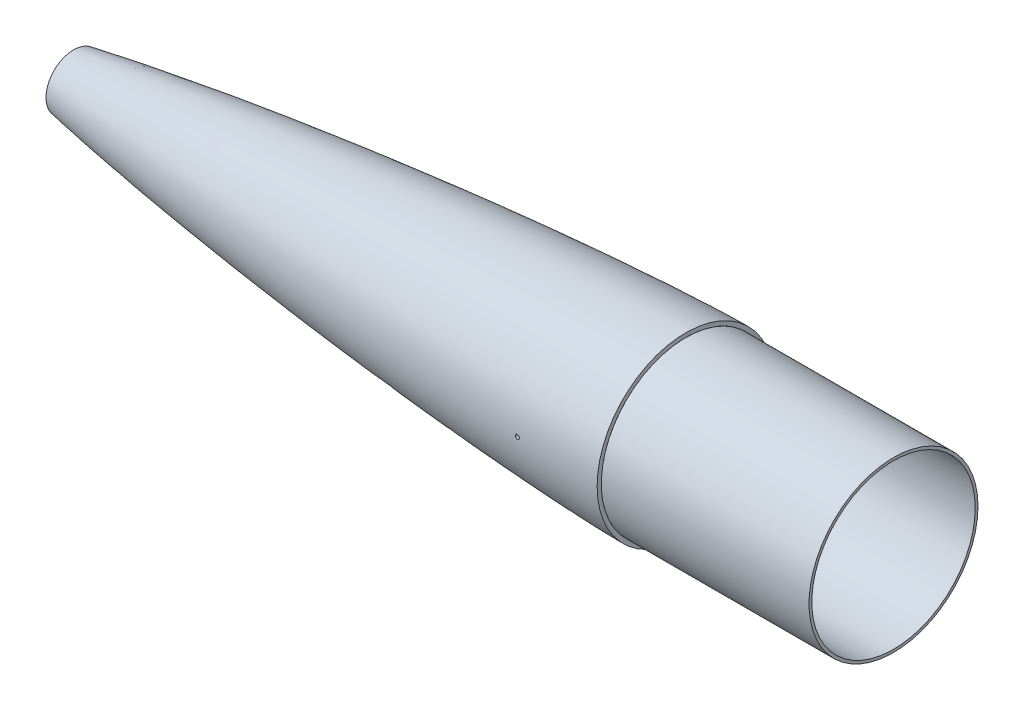
ISO-10303-21;
HEADER;
FILE_DESCRIPTION(('STEP AP214'),'2;1');
FILE_NAME('part.step','',(''),(''),'','','');
FILE_SCHEMA(('AUTOMOTIVE_DESIGN { 1 0 10303 214 1 1 1 1 }'));
ENDSEC;
DATA;
#1=APPLICATION_CONTEXT('core data for automotive mechanical design processes');
#2=APPLICATION_PROTOCOL_DEFINITION('international standard','automotive_design',2000,#1);
#3=PRODUCT_CONTEXT('',#1,'mechanical');
#4=PRODUCT('Part','Part','',(#3));
#5=PRODUCT_RELATED_PRODUCT_CATEGORY('part','',(#4));
#6=PRODUCT_DEFINITION_FORMATION('','',#4);
#7=PRODUCT_DEFINITION_CONTEXT('part definition',#1,'design');
#8=PRODUCT_DEFINITION('design','',#6,#7);
#9=PRODUCT_DEFINITION_SHAPE('','',#8);
#10=(LENGTH_UNIT() NAMED_UNIT(*) SI_UNIT(.MILLI.,.METRE.));
#11=(NAMED_UNIT(*) PLANE_ANGLE_UNIT() SI_UNIT($,.RADIAN.));
#12=(NAMED_UNIT(*) SI_UNIT($,.STERADIAN.) SOLID_ANGLE_UNIT());
#13=UNCERTAINTY_MEASURE_WITH_UNIT(LENGTH_MEASURE(1.E-05),#10,'distance_accuracy_value','');
#14=(GEOMETRIC_REPRESENTATION_CONTEXT(3) GLOBAL_UNCERTAINTY_ASSIGNED_CONTEXT((#13)) GLOBAL_UNIT_ASSIGNED_CONTEXT((#10,
#11,#12)) REPRESENTATION_CONTEXT('',''));
#15=CARTESIAN_POINT('',(0.,0.,0.));
#16=DIRECTION('',(0.,0.,1.));
#17=DIRECTION('',(1.,0.,0.));
#18=AXIS2_PLACEMENT_3D('',#15,#16,#17);
#19=CARTESIAN_POINT('',(672.,0.,0.));
#20=DIRECTION('',(1.,0.,0.));
#21=DIRECTION('',(0.,0.,-1.));
#22=AXIS2_PLACEMENT_3D('',#19,#20,#21);
#23=PLANE('',#22);
#24=CARTESIAN_POINT('',(672.,0.,0.));
#25=DIRECTION('',(1.,0.,0.));
#26=DIRECTION('',(0.,0.,-1.));
#27=AXIS2_PLACEMENT_3D('',#24,#25,#26);
#28=CIRCLE('',#27,61.);
#29=CARTESIAN_POINT('',(672.,0.,-61.));
#30=VERTEX_POINT('',#29);
#31=EDGE_CURVE('E12',#30,#30,#28,.T.);
#32=ORIENTED_EDGE('',*,*,#31,.T.);
#33=EDGE_LOOP('',(#32));
#34=FACE_BOUND('',#33,.T.);
#35=CARTESIAN_POINT('',(672.,0.,0.));
#36=DIRECTION('',(1.,0.,0.));
#37=DIRECTION('',(0.,0.,-1.));
#38=AXIS2_PLACEMENT_3D('',#35,#36,#37);
#39=CIRCLE('',#38,59.);
#40=CARTESIAN_POINT('',(672.,0.,-59.));
#41=VERTEX_POINT('',#40);
#42=EDGE_CURVE('E63',#41,#41,#39,.T.);
#43=ORIENTED_EDGE('',*,*,#42,.F.);
#44=EDGE_LOOP('',(#43));
#45=FACE_BOUND('',#44,.T.);
#46=ADVANCED_FACE('F52',(#34,#45),#23,.T.);
#47=CARTESIAN_POINT('',(522.,0.,0.));
#48=DIRECTION('',(1.,0.,0.));
#49=DIRECTION('',(0.,0.,-1.));
#50=AXIS2_PLACEMENT_3D('',#47,#48,#49);
#51=PLANE('',#50);
#52=CARTESIAN_POINT('',(522.,0.,0.));
#53=DIRECTION('',(1.,0.,0.));
#54=DIRECTION('',(0.,0.,-1.));
#55=AXIS2_PLACEMENT_3D('',#52,#53,#54);
#56=CIRCLE('',#55,61.);
#57=CARTESIAN_POINT('',(522.,0.,-61.));
#58=VERTEX_POINT('',#57);
#59=EDGE_CURVE('E56',#58,#58,#56,.T.);
#60=ORIENTED_EDGE('',*,*,#59,.F.);
#61=EDGE_LOOP('',(#60));
#62=FACE_BOUND('',#61,.T.);
#63=CARTESIAN_POINT('',(522.,0.,0.));
#64=DIRECTION('',(1.,0.,0.));
#65=DIRECTION('',(0.,0.,-1.));
#66=AXIS2_PLACEMENT_3D('',#63,#64,#65);
#67=CIRCLE('',#66,59.);
#68=CARTESIAN_POINT('',(522.,0.,-59.));
#69=VERTEX_POINT('',#68);
#70=EDGE_CURVE('E65',#69,#69,#67,.T.);
#71=ORIENTED_EDGE('',*,*,#70,.T.);
#72=EDGE_LOOP('',(#71));
#73=FACE_BOUND('',#72,.T.);
#74=ADVANCED_FACE('F75',(#62,#73),#51,.F.);
#75=CARTESIAN_POINT('',(672.,0.,0.));
#76=DIRECTION('',(-1.,0.,0.));
#77=DIRECTION('',(0.,0.,1.));
#78=AXIS2_PLACEMENT_3D('',#75,#76,#77);
#79=CYLINDRICAL_SURFACE('',#78,61.);
#80=ORIENTED_EDGE('',*,*,#31,.F.);
#81=EDGE_LOOP('',(#80));
#82=FACE_BOUND('',#81,.T.);
#83=ORIENTED_EDGE('',*,*,#59,.T.);
#84=EDGE_LOOP('',(#83));
#85=FACE_BOUND('',#84,.T.);
#86=ADVANCED_FACE('F54',(#82,#85),#79,.T.);
#87=CARTESIAN_POINT('',(672.,0.,0.));
#88=DIRECTION('',(-1.,0.,0.));
#89=DIRECTION('',(0.,0.,1.));
#90=AXIS2_PLACEMENT_3D('',#87,#88,#89);
#91=CYLINDRICAL_SURFACE('',#90,59.);
#92=ORIENTED_EDGE('',*,*,#42,.T.);
#93=EDGE_LOOP('',(#92));
#94=FACE_BOUND('',#93,.T.);
#95=ORIENTED_EDGE('',*,*,#70,.F.);
#96=EDGE_LOOP('',(#95));
#97=FACE_BOUND('',#96,.T.);
#98=ADVANCED_FACE('F71',(#94,#97),#91,.F.);
#99=CLOSED_SHELL('',(#46,#74,#86,#98));
#100=MANIFOLD_SOLID_BREP('B2',#99);
#101=CARTESIAN_POINT('',(522.,64.,0.));
#102=CARTESIAN_POINT('',(521.590516942007,64.,0.));
#103=CARTESIAN_POINT('',(520.771561040287,63.9942688934299,0.));
#104=CARTESIAN_POINT('',(519.133691426009,63.9802670014868,0.));
#105=CARTESIAN_POINT('',(516.677010913587,63.9463939524722,0.));
#106=CARTESIAN_POINT('',(513.81106355721,63.8963781150164,0.));
#107=CARTESIAN_POINT('',(508.079596574187,63.7736937527318,0.));
#108=CARTESIAN_POINT('',(502.151121166139,63.6094457906622,0.));
#109=CARTESIAN_POINT('',(496.025715941466,63.409883926183,0.));
#110=CARTESIAN_POINT('',(489.703465178406,63.1762923349364,0.));
#111=CARTESIAN_POINT('',(485.63900431218,63.0166861878967,0.));
#112=CARTESIAN_POINT('',(480.558876848224,62.8060522017456,0.));
#113=CARTESIAN_POINT('',(474.463438705073,62.5365027866264,0.));
#114=CARTESIAN_POINT('',(467.353134193147,62.1993055640769,0.));
#115=CARTESIAN_POINT('',(459.228488268017,61.7852756732708,0.));
#116=CARTESIAN_POINT('',(449.074445036233,61.234348915932,0.));
#117=CARTESIAN_POINT('',(436.892399390841,60.5230064918632,0.));
#118=CARTESIAN_POINT('',(422.684094329235,59.6255360051907,0.));
#119=CARTESIAN_POINT('',(406.451649281317,58.5145436942091,0.));
#120=CARTESIAN_POINT('',(390.224875337688,57.3236348081094,0.));
#121=CARTESIAN_POINT('',(374.003843123209,56.0568670763544,0.));
#122=CARTESIAN_POINT('',(357.788673830139,54.717201132632,0.));
#123=CARTESIAN_POINT('',(337.527208668775,52.9542978334076,0.));
#124=CARTESIAN_POINT('',(313.225812894759,50.7004206895206,0.));
#125=CARTESIAN_POINT('',(284.893049860698,47.8733531730444,0.));
#126=CARTESIAN_POINT('',(252.541063500701,44.3705230861258,0.));
#127=CARTESIAN_POINT('',(220.220524829406,40.5877041843803,0.));
#128=CARTESIAN_POINT('',(187.93626848825,36.5067060471793,0.));
#129=CARTESIAN_POINT('',(155.694792913666,32.0989089346133,0.));
#130=CARTESIAN_POINT('',(123.506939436542,27.3147890527032,0.));
#131=CARTESIAN_POINT('',(91.3889285154668,22.077714796997,0.));
#132=CARTESIAN_POINT('',(62.8439543785186,16.872422149387,0.));
#133=CARTESIAN_POINT('',(39.4821084234338,12.0345623327772,0.));
#134=CARTESIAN_POINT('',(22.6082275835392,7.96176973354541,0.));
#135=CARTESIAN_POINT('',(12.8800296426853,5.24028530882847,0.));
#136=CARTESIAN_POINT('',(7.19313976770063,3.38812297662853,0.));
#137=CARTESIAN_POINT('',(4.12322816040121,2.23009214067667,0.));
#138=CARTESIAN_POINT('',(2.46511193855896,1.51464459715414,0.));
#139=CARTESIAN_POINT('',(1.534590026526,1.06017013162303,0.));
#140=CARTESIAN_POINT('',(0.982994633851909,0.758855245518446,0.));
#141=CARTESIAN_POINT('',(0.660423816631462,0.562634850320563,0.));
#142=CARTESIAN_POINT('',(0.460446691137349,0.428551795033052,0.));
#143=CARTESIAN_POINT('',(0.333600700303157,0.33590032232443,0.));
#144=CARTESIAN_POINT('',(0.253680330401727,0.273933255901504,0.));
#145=CARTESIAN_POINT('',(0.184725886275937,0.216219225073717,0.));
#146=CARTESIAN_POINT('',(0.126589164605975,0.163112600127914,0.));
#147=CARTESIAN_POINT('',(0.0792582841063476,0.115021795232016,0.));
#148=CARTESIAN_POINT('',(0.0466617169851801,0.0779953229370678,0.));
#149=CARTESIAN_POINT('',(0.0215064173775888,0.0441662632204878,0.));
#150=CARTESIAN_POINT('',(0.00677148560998358,0.0199364911642674,0.));
#151=CARTESIAN_POINT('',(0.00182695339847098,0.00681618098661998,0.));
#152=CARTESIAN_POINT('',(0.,0.,0.));
#153=B_SPLINE_CURVE_WITH_KNOTS('',4,(#101,#102,#103,#104,#105,#106,#107,#108,#109,#110,#111,
#112,#113,#114,#115,#116,#117,#118,#119,#120,#121,#122,#123,#124,#125,#126,#127,#128,#129,#130,
#131,#132,#133,#134,#135,#136,#137,#138,#139,#140,#141,#142,#143,#144,#145,#146,#147,#148,#149,
#150,#151,#152),.UNSPECIFIED.,.F.,.F.,(5,1,1,1,1,1,1,1,1,1,1,1,1,1,1,1,1,1,1,1,1,1,1,1,1,1,1,1,
1,1,1,1,1,1,1,1,1,1,1,1,1,1,1,1,1,1,1,1,5),(0.,0.00310644739088894,0.00621289478177789,
0.0124257895635557,0.0186386843453334,0.0248515791271113,0.0497031582542228,0.0574176140747542,
0.0651320698952855,0.0728465257158168,0.0805609815363483,0.095989893177411,0.111418804818474,
0.12684768666646,0.142276568514445,0.173134332210417,0.20399214040648,0.234849948602543,
0.265707766276664,0.296565583950786,0.327423428677223,0.358281273403661,0.419996827228449,
0.481712432966205,0.543428043582617,0.605143624865866,0.666859247489944,0.72857493688404,
0.790290361928457,0.852005914200549,0.913721421920756,0.948680452149767,0.971252136817206,
0.983668328658008,0.990336505939893,0.99403931307382,0.996134647532728,0.997363630870977,
0.998189895614069,0.998806063777457,0.998997830505255,0.999189597233053,0.999381363960851,
0.999573130688649,0.999679848016487,0.999786565344324,0.999893282672162,0.999946641336081,1.),.UNSPECIFIED.);
#154=CARTESIAN_POINT('',(-5.18625797548872,0.,0.));
#155=DIRECTION('',(-1.,0.,0.));
#156=AXIS1_PLACEMENT('',#154,#155);
#157=SURFACE_OF_REVOLUTION('',#153,#156);
#158=CARTESIAN_POINT('',(80.,0.,0.));
#159=DIRECTION('',(-1.,0.,0.));
#160=DIRECTION('',(0.,0.,1.));
#161=AXIS2_PLACEMENT_3D('',#158,#159,#160);
#162=CIRCLE('',#161,19.9360865732292);
#163=CARTESIAN_POINT('',(80.,0.,19.9360865732292));
#164=VERTEX_POINT('',#163);
#165=EDGE_CURVE('E129',#164,#164,#162,.F.);
#166=ORIENTED_EDGE('',*,*,#165,.T.);
#167=EDGE_LOOP('',(#166));
#168=FACE_BOUND('',#167,.T.);
#169=CARTESIAN_POINT('',(522.,0.,0.));
#170=DIRECTION('',(-1.,0.,0.));
#171=DIRECTION('',(0.,0.,1.));
#172=AXIS2_PLACEMENT_3D('',#169,#170,#171);
#173=CIRCLE('',#172,64.);
#174=CARTESIAN_POINT('',(522.,0.,64.));
#175=VERTEX_POINT('',#174);
#176=EDGE_CURVE('E51',#175,#175,#173,.T.);
#177=ORIENTED_EDGE('',*,*,#176,.T.);
#178=EDGE_LOOP('',(#177));
#179=FACE_BOUND('',#178,.T.);
#180=CARTESIAN_POINT('',(460.837660246588,0.,61.8638069051147));
#181=CARTESIAN_POINT('',(460.837666027799,-0.0842370751397705,61.8638068896487));
#182=CARTESIAN_POINT('',(460.844789632762,-0.168561694612749,61.864002988358));
#183=CARTESIAN_POINT('',(460.865981434843,-0.293170848475532,61.8645972576345));
#184=CARTESIAN_POINT('',(460.874808022259,-0.334427408478112,61.8648456955621));
#185=CARTESIAN_POINT('',(460.895908942444,-0.416091306418316,61.8654459255403));
#186=CARTESIAN_POINT('',(460.908186312636,-0.456497862340091,61.8657978086573));
#187=CARTESIAN_POINT('',(460.950037272364,-0.575841458920336,61.8670124920384));
#188=CARTESIAN_POINT('',(460.984657704452,-0.653065965546182,61.8680350696924));
#189=CARTESIAN_POINT('',(461.06637895112,-0.800596422932289,61.8705407559452));
#190=CARTESIAN_POINT('',(461.113480019562,-0.870902232923232,61.8720238739116));
#191=CARTESIAN_POINT('',(461.192426062857,-0.969650775783818,61.8746193704708));
#192=CARTESIAN_POINT('',(461.220146083368,-1.00146846801379,61.8755471171123));
#193=CARTESIAN_POINT('',(461.278133334341,-1.06262749790153,61.8775294689821));
#194=CARTESIAN_POINT('',(461.308398090934,-1.0919711863222,61.8785839514228));
#195=CARTESIAN_POINT('',(461.402763306244,-1.1760322142952,61.8819451280918));
#196=CARTESIAN_POINT('',(461.470454375489,-1.22680406294593,61.8844501827811));
#197=CARTESIAN_POINT('',(461.613366058309,-1.31625070791574,61.8899955507075));
#198=CARTESIAN_POINT('',(461.688588968133,-1.35492180013615,61.8930360273957));
#199=CARTESIAN_POINT('',(461.844445779859,-1.41909753583378,61.8996354738888));
#200=CARTESIAN_POINT('',(461.925079690797,-1.44460215732054,61.9031944445597));
#201=CARTESIAN_POINT('',(462.089527080562,-1.48173640564699,61.9107811169701));
#202=CARTESIAN_POINT('',(462.173343115707,-1.49335462280733,61.9148092011762));
#203=CARTESIAN_POINT('',(462.341718029691,-1.5023618092746,61.9232403050907));
#204=CARTESIAN_POINT('',(462.426276912906,-1.49975069468264,61.9276433270097));
#205=CARTESIAN_POINT('',(462.593849327793,-1.48036826398961,61.9366997060638));
#206=CARTESIAN_POINT('',(462.6768608011,-1.46357929561787,61.9413533684959));
#207=CARTESIAN_POINT('',(462.838880539791,-1.41629792376656,61.9507408285188));
#208=CARTESIAN_POINT('',(462.917888770745,-1.38580540245713,61.9554746267982));
#209=CARTESIAN_POINT('',(463.069735953586,-1.31194506983985,61.9648352891637));
#210=CARTESIAN_POINT('',(463.1425691877,-1.26856548950026,61.9694620513184));
#211=CARTESIAN_POINT('',(463.2799174339,-1.17016584455206,61.9783976722214));
#212=CARTESIAN_POINT('',(463.344432451017,-1.11514578698358,61.9827065311621));
#213=CARTESIAN_POINT('',(463.463277979969,-0.995046894917016,61.9907974211621));
#214=CARTESIAN_POINT('',(463.51761325994,-0.929972795871852,61.994579698655));
#215=CARTESIAN_POINT('',(463.61458077874,-0.791588234535177,62.0014276995377));
#216=CARTESIAN_POINT('',(463.657213147157,-0.71827786345759,62.0044934308618));
#217=CARTESIAN_POINT('',(463.7294722341,-0.565661571969206,62.0097405545803));
#218=CARTESIAN_POINT('',(463.759125574802,-0.486368319112038,62.0119237564812));
#219=CARTESIAN_POINT('',(463.804698197319,-0.323908675214442,62.0152962030668));
#220=CARTESIAN_POINT('',(463.82061768719,-0.240742342868033,62.0164854628088));
#221=CARTESIAN_POINT('',(463.838240701521,-0.0731074059386987,62.0178027088474));
#222=CARTESIAN_POINT('',(463.839977643394,0.0113576673031792,62.0179331898708));
#223=CARTESIAN_POINT('',(463.829273297658,0.179378992215525,62.0171322171401));
#224=CARTESIAN_POINT('',(463.816832107269,0.262935250113878,62.0162007706677));
#225=CARTESIAN_POINT('',(463.778146556754,0.426699558819114,62.0133285489861));
#226=CARTESIAN_POINT('',(463.751913188778,0.506910221145377,62.0113885775692));
#227=CARTESIAN_POINT('',(463.68640360686,0.661786246117321,62.0066051261582));
#228=CARTESIAN_POINT('',(463.647127309143,0.736451573141194,62.0037616403608));
#229=CARTESIAN_POINT('',(463.556588827422,0.878235853236073,61.9973168946406));
#230=CARTESIAN_POINT('',(463.505309624153,0.945343888604484,61.9937145594558));
#231=CARTESIAN_POINT('',(463.392254887833,1.07000509379862,61.9859382996372));
#232=CARTESIAN_POINT('',(463.33047920444,1.12755812674474,61.9817643668167));
#233=CARTESIAN_POINT('',(463.198015377869,1.23162517215504,61.9730362109347));
#234=CARTESIAN_POINT('',(463.127305620839,1.27811159741821,61.9684810749837));
#235=CARTESIAN_POINT('',(462.979095528094,1.35855450899805,61.9592063659535));
#236=CARTESIAN_POINT('',(462.901595129248,1.39251087880853,61.9544867913457));
#237=CARTESIAN_POINT('',(462.741860463757,1.44698105582794,61.9450713246482));
#238=CARTESIAN_POINT('',(462.65961858821,1.46747256306952,61.9403754845627));
#239=CARTESIAN_POINT('',(462.492849616463,1.49433939271326,61.9311888918623));
#240=CARTESIAN_POINT('',(462.408322513951,1.5007146761106,61.926698139814));
#241=CARTESIAN_POINT('',(462.239381400354,1.49915820863997,61.918062436484));
#242=CARTESIAN_POINT('',(462.15496738636,1.49122683326171,61.9139174761296));
#243=CARTESIAN_POINT('',(461.988664887554,1.46128186909068,61.9060761546721));
#244=CARTESIAN_POINT('',(461.906776393448,1.4392683321314,61.9023797919179));
#245=CARTESIAN_POINT('',(461.747903003957,1.38177611702029,61.895500687542));
#246=CARTESIAN_POINT('',(461.670912773228,1.34631239296333,61.8923173810783));
#247=CARTESIAN_POINT('',(461.560794136447,1.28384852660663,61.887947705642));
#248=CARTESIAN_POINT('',(461.524976334323,1.26147759969063,61.8865584782034));
#249=CARTESIAN_POINT('',(461.455313350294,1.21377401556355,61.8839122313013));
#250=CARTESIAN_POINT('',(461.421470103329,1.18843852396538,61.8826553405805));
#251=CARTESIAN_POINT('',(461.323452462063,1.10836849135714,61.8790887637944));
#252=CARTESIAN_POINT('',(461.262603899514,1.04946447477291,61.8769758864022));
#253=CARTESIAN_POINT('',(461.151673035429,0.922256100704995,61.8732567880433));
#254=CARTESIAN_POINT('',(461.101590471935,0.853951972008965,61.8716505547485));
#255=CARTESIAN_POINT('',(461.035615526068,0.745966600294932,61.8695944743011));
#256=CARTESIAN_POINT('',(461.015138473256,0.709024403138267,61.8689677031725));
#257=CARTESIAN_POINT('',(460.977383966304,0.633582986440566,61.8678276666694));
#258=CARTESIAN_POINT('',(460.960103704035,0.595085169963751,61.8673143015988));
#259=CARTESIAN_POINT('',(460.913259177594,0.477661048458617,61.8659378001716));
#260=CARTESIAN_POINT('',(460.888617964512,0.396684007553707,61.8652360327229));
#261=CARTESIAN_POINT('',(460.859891728194,0.262675747774912,61.8644255924516));
#262=CARTESIAN_POINT('',(460.851566725075,0.210499428749106,61.8641933050101));
#263=CARTESIAN_POINT('',(460.84044917271,0.105560203457798,61.8638839661937));
#264=CARTESIAN_POINT('',(460.837656623097,0.0527972972312344,61.8638069148084));
#265=CARTESIAN_POINT('',(460.837660246588,0.,61.8638069051147));
#266=B_SPLINE_CURVE_WITH_KNOTS('',3,(#180,#181,#182,#183,#184,#185,#186,#187,#188,#189,#190,
#191,#192,#193,#194,#195,#196,#197,#198,#199,#200,#201,#202,#203,#204,#205,#206,#207,#208,#209,
#210,#211,#212,#213,#214,#215,#216,#217,#218,#219,#220,#221,#222,#223,#224,#225,#226,#227,#228,
#229,#230,#231,#232,#233,#234,#235,#236,#237,#238,#239,#240,#241,#242,#243,#244,#245,#246,#247,
#248,#249,#250,#251,#252,#253,#254,#255,#256,#257,#258,#259,#260,#261,#262,#263,#264,#265),
.UNSPECIFIED.,.T.,.F.,(4,2,2,2,2,2,2,2,2,2,2,2,2,2,2,2,2,2,2,2,2,2,2,2,2,2,2,2,2,2,2,2,2,2,2,2,
2,2,2,2,2,2,4),(0.,0.252485331728898,0.378936050144934,0.5054984225542,0.758131837412947,
1.01077039134415,1.13726649599376,1.2636410184841,1.51629688703939,1.76903001926361,
2.02176357359775,2.27470464247533,2.52764720274374,2.78090515664487,3.03416528822354,
3.28765742289587,3.54114940425706,3.79452235285327,4.0478924957064,4.3007404698738,
4.55358461353944,4.80583282458993,5.05807930595574,5.31012505489417,5.56217242276965,
5.81457936426467,6.06698992128796,6.32002325684595,6.57305894508372,6.82651265170361,
7.07996705864558,7.33341481357057,7.58686163561301,7.84002749429483,7.96665661146186,
8.09340780206124,8.34627527259365,8.59913658971787,8.72573020005776,8.85221207427852,
9.10475908921145,9.26300940795252,9.42125971618914),.UNSPECIFIED.);
#267=CARTESIAN_POINT('',(460.837660246588,0.,61.8638069051147));
#268=VERTEX_POINT('',#267);
#269=EDGE_CURVE('E153',#268,#268,#266,.T.);
#270=ORIENTED_EDGE('',*,*,#269,.F.);
#271=EDGE_LOOP('',(#270));
#272=FACE_BOUND('',#271,.T.);
#273=ADVANCED_FACE('F114',(#168,#179,#272),#157,.T.);
#274=CARTESIAN_POINT('',(522.,64.,0.));
#275=CARTESIAN_POINT('',(521.590516942007,64.,0.));
#276=CARTESIAN_POINT('',(520.771561040287,63.9942688934299,0.));
#277=CARTESIAN_POINT('',(519.133691426009,63.9802670014868,0.));
#278=CARTESIAN_POINT('',(516.677010913587,63.9463939524722,0.));
#279=CARTESIAN_POINT('',(513.81106355721,63.8963781150164,0.));
#280=CARTESIAN_POINT('',(508.079596574187,63.7736937527318,0.));
#281=CARTESIAN_POINT('',(502.151121166139,63.6094457906622,0.));
#282=CARTESIAN_POINT('',(496.025715941466,63.409883926183,0.));
#283=CARTESIAN_POINT('',(489.703465178406,63.1762923349364,0.));
#284=CARTESIAN_POINT('',(485.63900431218,63.0166861878967,0.));
#285=CARTESIAN_POINT('',(480.558876848224,62.8060522017456,0.));
#286=CARTESIAN_POINT('',(474.463438705073,62.5365027866264,0.));
#287=CARTESIAN_POINT('',(467.353134193147,62.1993055640769,0.));
#288=CARTESIAN_POINT('',(459.228488268017,61.7852756732708,0.));
#289=CARTESIAN_POINT('',(449.074445036233,61.234348915932,0.));
#290=CARTESIAN_POINT('',(436.892399390841,60.5230064918632,0.));
#291=CARTESIAN_POINT('',(422.684094329235,59.6255360051907,0.));
#292=CARTESIAN_POINT('',(406.451649281317,58.5145436942091,0.));
#293=CARTESIAN_POINT('',(390.224875337688,57.3236348081094,0.));
#294=CARTESIAN_POINT('',(374.003843123209,56.0568670763544,0.));
#295=CARTESIAN_POINT('',(357.788673830139,54.717201132632,0.));
#296=CARTESIAN_POINT('',(337.527208668775,52.9542978334076,0.));
#297=CARTESIAN_POINT('',(313.225812894759,50.7004206895206,0.));
#298=CARTESIAN_POINT('',(284.893049860698,47.8733531730444,0.));
#299=CARTESIAN_POINT('',(252.541063500701,44.3705230861258,0.));
#300=CARTESIAN_POINT('',(220.220524829406,40.5877041843803,0.));
#301=CARTESIAN_POINT('',(187.93626848825,36.5067060471793,0.));
#302=CARTESIAN_POINT('',(155.694792913666,32.0989089346133,0.));
#303=CARTESIAN_POINT('',(124.665008945171,27.4869143348317,0.));
#304=CARTESIAN_POINT('',(101.729661531689,23.7630447706086,0.));
#305=CARTESIAN_POINT('',(86.8535653702416,21.1735362402076,0.));
#306=CARTESIAN_POINT('',(80.,19.9360865732292,0.));
#307=B_SPLINE_CURVE_WITH_KNOTS('',4,(#274,#275,#276,#277,#278,#279,#280,#281,#282,#283,#284,
#285,#286,#287,#288,#289,#290,#291,#292,#293,#294,#295,#296,#297,#298,#299,#300,#301,#302,#303,
#304,#305,#306),.UNSPECIFIED.,.F.,.F.,(5,1,1,1,1,1,1,1,1,1,1,1,1,1,1,1,1,1,1,1,1,1,1,1,1,1,1,1,
1,5),(0.,0.00310644739088894,0.00621289478177789,0.0124257895635557,0.0186386843453334,
0.0248515791271113,0.0497031582542228,0.0574176140747542,0.0651320698952855,0.0728465257158168,
0.0805609815363483,0.095989893177411,0.111418804818474,0.12684768666646,0.142276568514445,
0.173134332210417,0.20399214040648,0.234849948602543,0.265707766276664,0.296565583950786,
0.327423428677223,0.358281273403661,0.419996827228449,0.481712432966205,0.543428043582617,
0.605143624865866,0.666859247489944,0.72857493688404,0.790290361928457,0.84312418835599),.UNSPECIFIED.);
#308=CARTESIAN_POINT('',(-5.18625797548872,0.,0.));
#309=DIRECTION('',(-1.,0.,0.));
#310=AXIS1_PLACEMENT('',#308,#309);
#311=SURFACE_OF_REVOLUTION('',#307,#310);
#312=OFFSET_SURFACE('',#311,-3.,.F.);
#313=CARTESIAN_POINT('',(522.,0.,0.));
#314=DIRECTION('',(-1.,0.,0.));
#315=DIRECTION('',(0.,0.,1.));
#316=AXIS2_PLACEMENT_3D('',#313,#314,#315);
#317=CIRCLE('',#316,61.);
#318=CARTESIAN_POINT('',(522.,0.,61.));
#319=VERTEX_POINT('',#318);
#320=EDGE_CURVE('E135',#319,#319,#317,.T.);
#321=ORIENTED_EDGE('',*,*,#320,.F.);
#322=EDGE_LOOP('',(#321));
#323=FACE_BOUND('',#322,.T.);
#324=CARTESIAN_POINT('',(83.,0.,0.));
#325=DIRECTION('',(-1.,0.,0.));
#326=DIRECTION('',(0.,0.,1.));
#327=AXIS2_PLACEMENT_3D('',#324,#325,#326);
#328=CIRCLE('',#327,17.4271010671349);
#329=CARTESIAN_POINT('',(83.,0.,17.4271010671349));
#330=VERTEX_POINT('',#329);
#331=EDGE_CURVE('E144',#330,#330,#328,.F.);
#332=ORIENTED_EDGE('',*,*,#331,.F.);
#333=EDGE_LOOP('',(#332));
#334=FACE_BOUND('',#333,.T.);
#335=CARTESIAN_POINT('',(460.837660246588,0.,58.8597578813491));
#336=CARTESIAN_POINT('',(460.837666027168,-0.084239020388774,58.8597578498814));
#337=CARTESIAN_POINT('',(460.844789954198,-0.1685655478458,58.8599455364727));
#338=CARTESIAN_POINT('',(460.865982740885,-0.293177541221433,58.8605153543279));
#339=CARTESIAN_POINT('',(460.874809735646,-0.334435030508645,58.8607536562279));
#340=CARTESIAN_POINT('',(460.895911646636,-0.41610078077672,58.8613299870545));
#341=CARTESIAN_POINT('',(460.908189600919,-0.456508259607786,58.8616681038663));
#342=CARTESIAN_POINT('',(460.950042622875,-0.575854683214812,58.8628366608941));
#343=CARTESIAN_POINT('',(460.984664827753,-0.653081059766016,58.8638220161537));
#344=CARTESIAN_POINT('',(461.066390466674,-0.800614976764113,58.8662446754475));
#345=CARTESIAN_POINT('',(461.113494151465,-0.870922378173363,58.8676819885614));
#346=CARTESIAN_POINT('',(461.192444278369,-0.969672321370872,58.8702064653264));
#347=CARTESIAN_POINT('',(461.220165412834,-1.00149007070083,58.8711101262751));
#348=CARTESIAN_POINT('',(461.278154992322,-1.06264912459077,58.8730442788537));
#349=CARTESIAN_POINT('',(461.30842096345,-1.09199277993628,58.8740746477484));
#350=CARTESIAN_POINT('',(461.402789938684,-1.17605350719007,58.8773644881668));
#351=CARTESIAN_POINT('',(461.470483688964,-1.22682490994274,58.8798233066088));
#352=CARTESIAN_POINT('',(461.613397904255,-1.31626813463252,58.8852844138035));
#353=CARTESIAN_POINT('',(461.688620364987,-1.35493673707062,58.88828684683));
#354=CARTESIAN_POINT('',(461.844475483738,-1.41910775817379,58.8948231435843));
#355=CARTESIAN_POINT('',(461.925108149574,-1.44461015781844,58.8983570080799));
#356=CARTESIAN_POINT('',(462.089549879162,-1.48173997759187,58.9059095253695));
#357=CARTESIAN_POINT('',(462.173361417988,-1.49335634734584,58.9099285614623));
#358=CARTESIAN_POINT('',(462.341726229525,-1.50236150238016,58.9183591561768));
#359=CARTESIAN_POINT('',(462.426279506696,-1.49975020205811,58.92277071716));
#360=CARTESIAN_POINT('',(462.59384221828,-1.48036927917076,58.9318613558199));
#361=CARTESIAN_POINT('',(462.676849549373,-1.46358162934601,58.9365407670403));
#362=CARTESIAN_POINT('',(462.838860787505,-1.41630463761067,58.945994350314));
#363=CARTESIAN_POINT('',(462.917864658328,-1.38581517177222,58.950768523224));
#364=CARTESIAN_POINT('',(463.069708883212,-1.31196019764881,58.9602208161035));
#365=CARTESIAN_POINT('',(463.142543095462,-1.26858204802193,58.9648988369274));
#366=CARTESIAN_POINT('',(463.279893494554,-1.17018512909096,58.9739421388543));
#367=CARTESIAN_POINT('',(463.344409683822,-1.11516636318236,58.9783074200485));
#368=CARTESIAN_POINT('',(463.463260296268,-0.995067194278374,58.9865104587821));
#369=CARTESIAN_POINT('',(463.517599097271,-0.929991139534942,58.9903484429491));
#370=CARTESIAN_POINT('',(463.614573057923,-0.791601120800361,58.9973009980426));
#371=CARTESIAN_POINT('',(463.657208350012,-0.718287250043966,59.0004155771552));
#372=CARTESIAN_POINT('',(463.72947056163,-0.56566584805135,59.0057480193677));
#373=CARTESIAN_POINT('',(463.759124680785,-0.486371261233634,59.0079677566617));
#374=CARTESIAN_POINT('',(463.804698418344,-0.323908132195836,59.0113972431946));
#375=CARTESIAN_POINT('',(463.820618252719,-0.240739650913812,59.0126070083151));
#376=CARTESIAN_POINT('',(463.838240415773,-0.0731074428959635,59.0139468980386));
#377=CARTESIAN_POINT('',(463.839977399883,0.0113526211298722,59.0140796542798));
#378=CARTESIAN_POINT('',(463.829274821829,0.179363935238809,59.0132649776652));
#379=CARTESIAN_POINT('',(463.816835360533,0.262915191783957,59.0123175524949));
#380=CARTESIAN_POINT('',(463.778155771231,0.426666831489199,59.0093969371641));
#381=CARTESIAN_POINT('',(463.751927093214,0.506869935263089,59.0074245980648));
#382=CARTESIAN_POINT('',(463.686429800845,0.661731728008768,59.0025635164347));
#383=CARTESIAN_POINT('',(463.647161098476,0.736390379553019,58.9996747677184));
#384=CARTESIAN_POINT('',(463.55663795758,0.878167198444465,58.9931312127717));
#385=CARTESIAN_POINT('',(463.505365805106,0.945274002404795,58.989475275206));
#386=CARTESIAN_POINT('',(463.392326272031,1.06993431010694,58.9815894140417));
#387=CARTESIAN_POINT('',(463.330558735601,1.12748767197954,58.977359481921));
#388=CARTESIAN_POINT('',(463.198106076915,1.23156189921208,58.968522350614));
#389=CARTESIAN_POINT('',(463.127398606724,1.27805424464987,58.9639142164995));
#390=CARTESIAN_POINT('',(462.979191579304,1.35850925094974,58.9545425619156));
#391=CARTESIAN_POINT('',(462.901691957852,1.39247179332078,58.9497790399772));
#392=CARTESIAN_POINT('',(462.741955386317,1.44695475590795,58.9402890968258));
#393=CARTESIAN_POINT('',(462.659710734804,1.46745261420125,58.9355627509299));
#394=CARTESIAN_POINT('',(462.492934159911,1.49433087142016,58.92633177956));
#395=CARTESIAN_POINT('',(462.408402230935,1.50071123579739,58.9218271546287));
#396=CARTESIAN_POINT('',(462.239454506189,1.4991630519714,58.9131817177772));
#397=CARTESIAN_POINT('',(462.155038701519,1.4912356696936,58.9090408762414));
#398=CARTESIAN_POINT('',(461.988731378205,1.46129784542936,58.9012246324491));
#399=CARTESIAN_POINT('',(461.906839849324,1.43928746056957,58.8975492283047));
#400=CARTESIAN_POINT('',(461.747964581715,1.38180222243696,58.8907263026739));
#401=CARTESIAN_POINT('',(461.670975214892,1.34634314722361,58.8875781688073));
#402=CARTESIAN_POINT('',(461.560857047702,1.28388654911147,58.8832683829589));
#403=CARTESIAN_POINT('',(461.525039264036,1.26151809434917,58.8819003116631));
#404=CARTESIAN_POINT('',(461.455376059266,1.21381955250118,58.879298122927));
#405=CARTESIAN_POINT('',(461.421532572587,1.18848663149968,58.878064135875));
#406=CARTESIAN_POINT('',(461.323514408334,1.10842490690579,58.8745677635865));
#407=CARTESIAN_POINT('',(461.262665101577,1.04952686196531,58.8725037619345));
#408=CARTESIAN_POINT('',(461.151731433687,0.922330855144265,58.8688806922472));
#409=CARTESIAN_POINT('',(461.101646813981,0.854033119113165,58.8673216120829));
#410=CARTESIAN_POINT('',(461.035666903403,0.746056235782572,58.8653307265224));
#411=CARTESIAN_POINT('',(461.015187609186,0.709116007664556,58.864724768798));
#412=CARTESIAN_POINT('',(460.977428447576,0.633678431512554,58.8636239123887));
#413=CARTESIAN_POINT('',(460.960145772036,0.595182486715278,58.863128916145));
#414=CARTESIAN_POINT('',(460.913293701827,0.477763741679544,58.861802982555));
#415=CARTESIAN_POINT('',(460.888647092102,0.396790047216834,58.8611289520627));
#416=CARTESIAN_POINT('',(460.859907343462,0.262767326301062,58.8603510595445));
#417=CARTESIAN_POINT('',(460.851576494895,0.210573042231095,58.8601282918234));
#418=CARTESIAN_POINT('',(460.840451134434,0.105597305071772,58.8598317125936));
#419=CARTESIAN_POINT('',(460.837656622303,0.0528158520074045,58.8597579010785));
#420=CARTESIAN_POINT('',(460.837660246588,0.,58.8597578813491));
#421=B_SPLINE_CURVE_WITH_KNOTS('',3,(#335,#336,#337,#338,#339,#340,#341,#342,#343,#344,#345,
#346,#347,#348,#349,#350,#351,#352,#353,#354,#355,#356,#357,#358,#359,#360,#361,#362,#363,#364,
#365,#366,#367,#368,#369,#370,#371,#372,#373,#374,#375,#376,#377,#378,#379,#380,#381,#382,#383,
#384,#385,#386,#387,#388,#389,#390,#391,#392,#393,#394,#395,#396,#397,#398,#399,#400,#401,#402,
#403,#404,#405,#406,#407,#408,#409,#410,#411,#412,#413,#414,#415,#416,#417,#418,#419,#420),
.UNSPECIFIED.,.T.,.F.,(4,2,2,2,2,2,2,2,2,2,2,2,2,2,2,2,2,2,2,2,2,2,2,2,2,2,2,2,2,2,2,2,2,2,2,2,
2,2,2,2,2,2,4),(0.,0.252491101881712,0.378944620557007,0.505509813212116,0.758149146612062,
1.01079355579376,1.13729040770671,1.26366568009335,1.51632296008605,1.76904739312197,
2.02177219125259,2.27469797184901,2.52762527420393,2.7808746950469,3.0341264064831,
3.28762733415789,3.54112818788837,3.79451974598795,4.04790843651676,4.30076362695053,
4.55361484120372,4.805848034574,5.05807943327396,5.31010171961188,5.56212570705848,
5.81452398677321,6.06692601428289,6.31997195255219,6.57302028374907,6.82649155774007,
7.07996345202625,7.33341469204835,7.58686490397114,7.84001868225523,7.96664175922794,
8.09338688736054,8.34624002087098,8.59908708005625,8.72567788452321,8.85215694848588,
9.10469860744029,9.26300449912978,9.42131038408225),.UNSPECIFIED.);
#422=CARTESIAN_POINT('',(460.837660246588,0.,58.8597578813491));
#423=VERTEX_POINT('',#422);
#424=EDGE_CURVE('E119',#423,#423,#421,.T.);
#425=ORIENTED_EDGE('',*,*,#424,.T.);
#426=EDGE_LOOP('',(#425));
#427=FACE_BOUND('',#426,.T.);
#428=ADVANCED_FACE('F175',(#323,#334,#427),#312,.F.);
#429=CARTESIAN_POINT('',(522.,64.,0.));
#430=DIRECTION('',(-1.,0.,0.));
#431=DIRECTION('',(0.,0.,1.));
#432=AXIS2_PLACEMENT_3D('',#429,#430,#431);
#433=PLANE('',#432);
#434=ORIENTED_EDGE('',*,*,#320,.T.);
#435=EDGE_LOOP('',(#434));
#436=FACE_BOUND('',#435,.T.);
#437=ORIENTED_EDGE('',*,*,#176,.F.);
#438=EDGE_LOOP('',(#437));
#439=FACE_BOUND('',#438,.T.);
#440=ADVANCED_FACE('F185',(#436,#439),#433,.F.);
#441=CARTESIAN_POINT('',(80.,0.,0.));
#442=DIRECTION('',(1.,0.,0.));
#443=DIRECTION('',(0.,0.,-1.));
#444=AXIS2_PLACEMENT_3D('',#441,#442,#443);
#445=PLANE('',#444);
#446=CARTESIAN_POINT('',(80.,0.,0.));
#447=DIRECTION('',(-1.,0.,0.));
#448=DIRECTION('',(0.,0.,1.));
#449=AXIS2_PLACEMENT_3D('',#446,#447,#448);
#450=CIRCLE('',#449,4.);
#451=CARTESIAN_POINT('',(80.,0.,4.));
#452=VERTEX_POINT('',#451);
#453=EDGE_CURVE('E145',#452,#452,#450,.T.);
#454=ORIENTED_EDGE('',*,*,#453,.F.);
#455=EDGE_LOOP('',(#454));
#456=FACE_BOUND('',#455,.T.);
#457=ORIENTED_EDGE('',*,*,#165,.F.);
#458=EDGE_LOOP('',(#457));
#459=FACE_BOUND('',#458,.T.);
#460=ADVANCED_FACE('F182',(#456,#459),#445,.F.);
#461=CARTESIAN_POINT('',(83.,0.,0.));
#462=DIRECTION('',(1.,0.,0.));
#463=DIRECTION('',(0.,0.,-1.));
#464=AXIS2_PLACEMENT_3D('',#461,#462,#463);
#465=PLANE('',#464);
#466=CARTESIAN_POINT('',(83.,0.,0.));
#467=DIRECTION('',(1.,0.,0.));
#468=DIRECTION('',(0.,0.,-1.));
#469=AXIS2_PLACEMENT_3D('',#466,#467,#468);
#470=CIRCLE('',#469,4.);
#471=CARTESIAN_POINT('',(83.,0.,-4.));
#472=VERTEX_POINT('',#471);
#473=EDGE_CURVE('E141',#472,#472,#470,.T.);
#474=ORIENTED_EDGE('',*,*,#473,.F.);
#475=EDGE_LOOP('',(#474));
#476=FACE_BOUND('',#475,.T.);
#477=ORIENTED_EDGE('',*,*,#331,.T.);
#478=EDGE_LOOP('',(#477));
#479=FACE_BOUND('',#478,.T.);
#480=ADVANCED_FACE('F178',(#476,#479),#465,.T.);
#481=CARTESIAN_POINT('',(90.,0.,0.));
#482=DIRECTION('',(-1.,0.,0.));
#483=DIRECTION('',(0.,0.,1.));
#484=AXIS2_PLACEMENT_3D('',#481,#482,#483);
#485=CYLINDRICAL_SURFACE('',#484,4.);
#486=ORIENTED_EDGE('',*,*,#473,.T.);
#487=EDGE_LOOP('',(#486));
#488=FACE_BOUND('',#487,.T.);
#489=ORIENTED_EDGE('',*,*,#453,.T.);
#490=EDGE_LOOP('',(#489));
#491=FACE_BOUND('',#490,.T.);
#492=ADVANCED_FACE('F181',(#488,#491),#485,.F.);
#493=CARTESIAN_POINT('',(462.337660246588,0.,64.));
#494=DIRECTION('',(0.,0.,-1.));
#495=DIRECTION('',(-1.,0.,0.));
#496=AXIS2_PLACEMENT_3D('',#493,#494,#495);
#497=CYLINDRICAL_SURFACE('',#496,1.50000000000002);
#498=ORIENTED_EDGE('',*,*,#424,.F.);
#499=EDGE_LOOP('',(#498));
#500=FACE_BOUND('',#499,.T.);
#501=ORIENTED_EDGE('',*,*,#269,.T.);
#502=EDGE_LOOP('',(#501));
#503=FACE_BOUND('',#502,.T.);
#504=ADVANCED_FACE('F203',(#500,#503),#497,.F.);
#505=CLOSED_SHELL('',(#273,#428,#440,#460,#480,#492,#504));
#506=MANIFOLD_SOLID_BREP('B7',#505);
#507=ADVANCED_BREP_SHAPE_REPRESENTATION('',(#18,#100,#506),#14);
#508=SHAPE_DEFINITION_REPRESENTATION(#9,#507);
ENDSEC;
END-ISO-10303-21;
